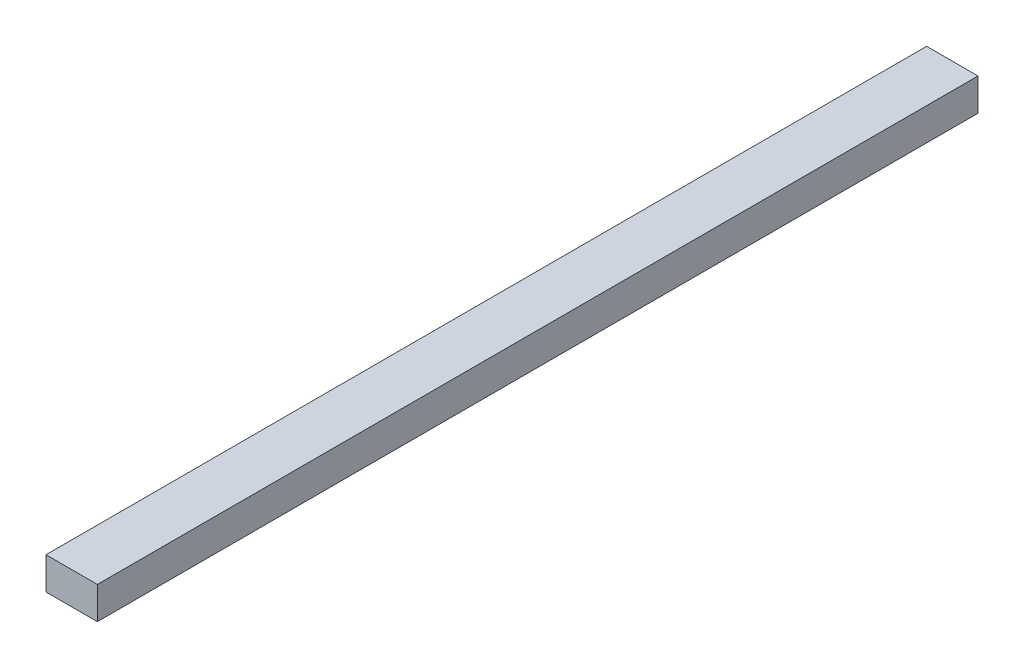
ISO-10303-21;
HEADER;
FILE_DESCRIPTION(('STEP AP214'),'2;1');
FILE_NAME('part.step','',(''),(''),'','','');
FILE_SCHEMA(('AUTOMOTIVE_DESIGN { 1 0 10303 214 1 1 1 1 }'));
ENDSEC;
DATA;
#1=APPLICATION_CONTEXT('core data for automotive mechanical design processes');
#2=APPLICATION_PROTOCOL_DEFINITION('international standard','automotive_design',2000,#1);
#3=PRODUCT_CONTEXT('',#1,'mechanical');
#4=PRODUCT('Part','Part','',(#3));
#5=PRODUCT_RELATED_PRODUCT_CATEGORY('part','',(#4));
#6=PRODUCT_DEFINITION_FORMATION('','',#4);
#7=PRODUCT_DEFINITION_CONTEXT('part definition',#1,'design');
#8=PRODUCT_DEFINITION('design','',#6,#7);
#9=PRODUCT_DEFINITION_SHAPE('','',#8);
#10=(LENGTH_UNIT() NAMED_UNIT(*) SI_UNIT(.MILLI.,.METRE.));
#11=(NAMED_UNIT(*) PLANE_ANGLE_UNIT() SI_UNIT($,.RADIAN.));
#12=(NAMED_UNIT(*) SI_UNIT($,.STERADIAN.) SOLID_ANGLE_UNIT());
#13=UNCERTAINTY_MEASURE_WITH_UNIT(LENGTH_MEASURE(1.E-05),#10,'distance_accuracy_value','');
#14=(GEOMETRIC_REPRESENTATION_CONTEXT(3) GLOBAL_UNCERTAINTY_ASSIGNED_CONTEXT((#13)) GLOBAL_UNIT_ASSIGNED_CONTEXT((#10,
#11,#12)) REPRESENTATION_CONTEXT('',''));
#15=CARTESIAN_POINT('',(0.,0.,0.));
#16=DIRECTION('',(0.,0.,1.));
#17=DIRECTION('',(1.,0.,0.));
#18=AXIS2_PLACEMENT_3D('',#15,#16,#17);
#19=CARTESIAN_POINT('',(35.,-22.,-600.));
#20=DIRECTION('',(1.,0.,0.));
#21=DIRECTION('',(0.,0.,-1.));
#22=AXIS2_PLACEMENT_3D('',#19,#20,#21);
#23=PLANE('',#22);
#24=DIRECTION('',(0.,0.,1.));
#25=VECTOR('',#24,1.);
#26=CARTESIAN_POINT('',(35.,22.,-600.));
#27=LINE('',#26,#25);
#28=CARTESIAN_POINT('',(35.,22.,-600.));
#29=VERTEX_POINT('',#28);
#30=CARTESIAN_POINT('',(35.,22.,600.));
#31=VERTEX_POINT('',#30);
#32=EDGE_CURVE('E34',#29,#31,#27,.T.);
#33=ORIENTED_EDGE('',*,*,#32,.T.);
#34=DIRECTION('',(0.,1.,0.));
#35=VECTOR('',#34,1.);
#36=CARTESIAN_POINT('',(35.,-22.,600.));
#37=LINE('',#36,#35);
#38=CARTESIAN_POINT('',(35.,-22.,600.));
#39=VERTEX_POINT('',#38);
#40=EDGE_CURVE('E71',#39,#31,#37,.T.);
#41=ORIENTED_EDGE('',*,*,#40,.F.);
#42=DIRECTION('',(0.,0.,1.));
#43=VECTOR('',#42,1.);
#44=CARTESIAN_POINT('',(35.,-22.,-600.));
#45=LINE('',#44,#43);
#46=CARTESIAN_POINT('',(35.,-22.,-600.));
#47=VERTEX_POINT('',#46);
#48=EDGE_CURVE('E11',#47,#39,#45,.T.);
#49=ORIENTED_EDGE('',*,*,#48,.F.);
#50=DIRECTION('',(0.,1.,0.));
#51=VECTOR('',#50,1.);
#52=CARTESIAN_POINT('',(35.,-22.,-600.));
#53=LINE('',#52,#51);
#54=EDGE_CURVE('E72',#47,#29,#53,.T.);
#55=ORIENTED_EDGE('',*,*,#54,.T.);
#56=EDGE_LOOP('',(#33,#41,#49,#55));
#57=FACE_BOUND('',#56,.T.);
#58=ADVANCED_FACE('F31',(#57),#23,.T.);
#59=CARTESIAN_POINT('',(-35.,-22.,-600.));
#60=DIRECTION('',(0.,-1.,0.));
#61=DIRECTION('',(0.,0.,-1.));
#62=AXIS2_PLACEMENT_3D('',#59,#60,#61);
#63=PLANE('',#62);
#64=ORIENTED_EDGE('',*,*,#48,.T.);
#65=DIRECTION('',(1.,0.,0.));
#66=VECTOR('',#65,1.);
#67=CARTESIAN_POINT('',(-35.,-22.,600.));
#68=LINE('',#67,#66);
#69=CARTESIAN_POINT('',(-35.,-22.,600.));
#70=VERTEX_POINT('',#69);
#71=EDGE_CURVE('E88',#70,#39,#68,.T.);
#72=ORIENTED_EDGE('',*,*,#71,.F.);
#73=DIRECTION('',(0.,0.,1.));
#74=VECTOR('',#73,1.);
#75=CARTESIAN_POINT('',(-35.,-22.,-600.));
#76=LINE('',#75,#74);
#77=CARTESIAN_POINT('',(-35.,-22.,-600.));
#78=VERTEX_POINT('',#77);
#79=EDGE_CURVE('E39',#78,#70,#76,.T.);
#80=ORIENTED_EDGE('',*,*,#79,.F.);
#81=DIRECTION('',(1.,0.,0.));
#82=VECTOR('',#81,1.);
#83=CARTESIAN_POINT('',(-35.,-22.,-600.));
#84=LINE('',#83,#82);
#85=EDGE_CURVE('E77',#78,#47,#84,.T.);
#86=ORIENTED_EDGE('',*,*,#85,.T.);
#87=EDGE_LOOP('',(#64,#72,#80,#86));
#88=FACE_BOUND('',#87,.T.);
#89=ADVANCED_FACE('F103',(#88),#63,.T.);
#90=CARTESIAN_POINT('',(-35.,-22.,-600.));
#91=DIRECTION('',(-1.,0.,0.));
#92=DIRECTION('',(0.,0.,1.));
#93=AXIS2_PLACEMENT_3D('',#90,#91,#92);
#94=PLANE('',#93);
#95=ORIENTED_EDGE('',*,*,#79,.T.);
#96=DIRECTION('',(0.,-1.,0.));
#97=VECTOR('',#96,1.);
#98=CARTESIAN_POINT('',(-35.,-22.,600.));
#99=LINE('',#98,#97);
#100=CARTESIAN_POINT('',(-35.,22.,600.));
#101=VERTEX_POINT('',#100);
#102=EDGE_CURVE('E84',#101,#70,#99,.T.);
#103=ORIENTED_EDGE('',*,*,#102,.F.);
#104=DIRECTION('',(0.,0.,1.));
#105=VECTOR('',#104,1.);
#106=CARTESIAN_POINT('',(-35.,22.,-600.));
#107=LINE('',#106,#105);
#108=CARTESIAN_POINT('',(-35.,22.,-600.));
#109=VERTEX_POINT('',#108);
#110=EDGE_CURVE('E76',#109,#101,#107,.T.);
#111=ORIENTED_EDGE('',*,*,#110,.F.);
#112=DIRECTION('',(0.,-1.,0.));
#113=VECTOR('',#112,1.);
#114=CARTESIAN_POINT('',(-35.,-22.,-600.));
#115=LINE('',#114,#113);
#116=EDGE_CURVE('E96',#109,#78,#115,.T.);
#117=ORIENTED_EDGE('',*,*,#116,.T.);
#118=EDGE_LOOP('',(#95,#103,#111,#117));
#119=FACE_BOUND('',#118,.T.);
#120=ADVANCED_FACE('F100',(#119),#94,.T.);
#121=CARTESIAN_POINT('',(-35.,22.,-600.));
#122=DIRECTION('',(0.,1.,0.));
#123=DIRECTION('',(0.,0.,1.));
#124=AXIS2_PLACEMENT_3D('',#121,#122,#123);
#125=PLANE('',#124);
#126=ORIENTED_EDGE('',*,*,#110,.T.);
#127=DIRECTION('',(-1.,0.,0.));
#128=VECTOR('',#127,1.);
#129=CARTESIAN_POINT('',(-35.,22.,600.));
#130=LINE('',#129,#128);
#131=EDGE_CURVE('E79',#31,#101,#130,.T.);
#132=ORIENTED_EDGE('',*,*,#131,.F.);
#133=ORIENTED_EDGE('',*,*,#32,.F.);
#134=DIRECTION('',(-1.,0.,0.));
#135=VECTOR('',#134,1.);
#136=CARTESIAN_POINT('',(-35.,22.,-600.));
#137=LINE('',#136,#135);
#138=EDGE_CURVE('E94',#29,#109,#137,.T.);
#139=ORIENTED_EDGE('',*,*,#138,.T.);
#140=EDGE_LOOP('',(#126,#132,#133,#139));
#141=FACE_BOUND('',#140,.T.);
#142=ADVANCED_FACE('F80',(#141),#125,.T.);
#143=CARTESIAN_POINT('',(35.,22.,-600.));
#144=DIRECTION('',(0.,0.,-1.));
#145=DIRECTION('',(-1.,0.,0.));
#146=AXIS2_PLACEMENT_3D('',#143,#144,#145);
#147=PLANE('',#146);
#148=ORIENTED_EDGE('',*,*,#54,.F.);
#149=ORIENTED_EDGE('',*,*,#85,.F.);
#150=ORIENTED_EDGE('',*,*,#116,.F.);
#151=ORIENTED_EDGE('',*,*,#138,.F.);
#152=EDGE_LOOP('',(#148,#149,#150,#151));
#153=FACE_BOUND('',#152,.T.);
#154=ADVANCED_FACE('F105',(#153),#147,.T.);
#155=CARTESIAN_POINT('',(35.,22.,600.));
#156=DIRECTION('',(0.,0.,-1.));
#157=DIRECTION('',(-1.,0.,0.));
#158=AXIS2_PLACEMENT_3D('',#155,#156,#157);
#159=PLANE('',#158);
#160=ORIENTED_EDGE('',*,*,#40,.T.);
#161=ORIENTED_EDGE('',*,*,#131,.T.);
#162=ORIENTED_EDGE('',*,*,#102,.T.);
#163=ORIENTED_EDGE('',*,*,#71,.T.);
#164=EDGE_LOOP('',(#160,#161,#162,#163));
#165=FACE_BOUND('',#164,.T.);
#166=ADVANCED_FACE('F87',(#165),#159,.F.);
#167=CLOSED_SHELL('',(#58,#89,#120,#142,#154,#166));
#168=MANIFOLD_SOLID_BREP('B2',#167);
#169=ADVANCED_BREP_SHAPE_REPRESENTATION('',(#18,#168),#14);
#170=SHAPE_DEFINITION_REPRESENTATION(#9,#169);
ENDSEC;
END-ISO-10303-21;
